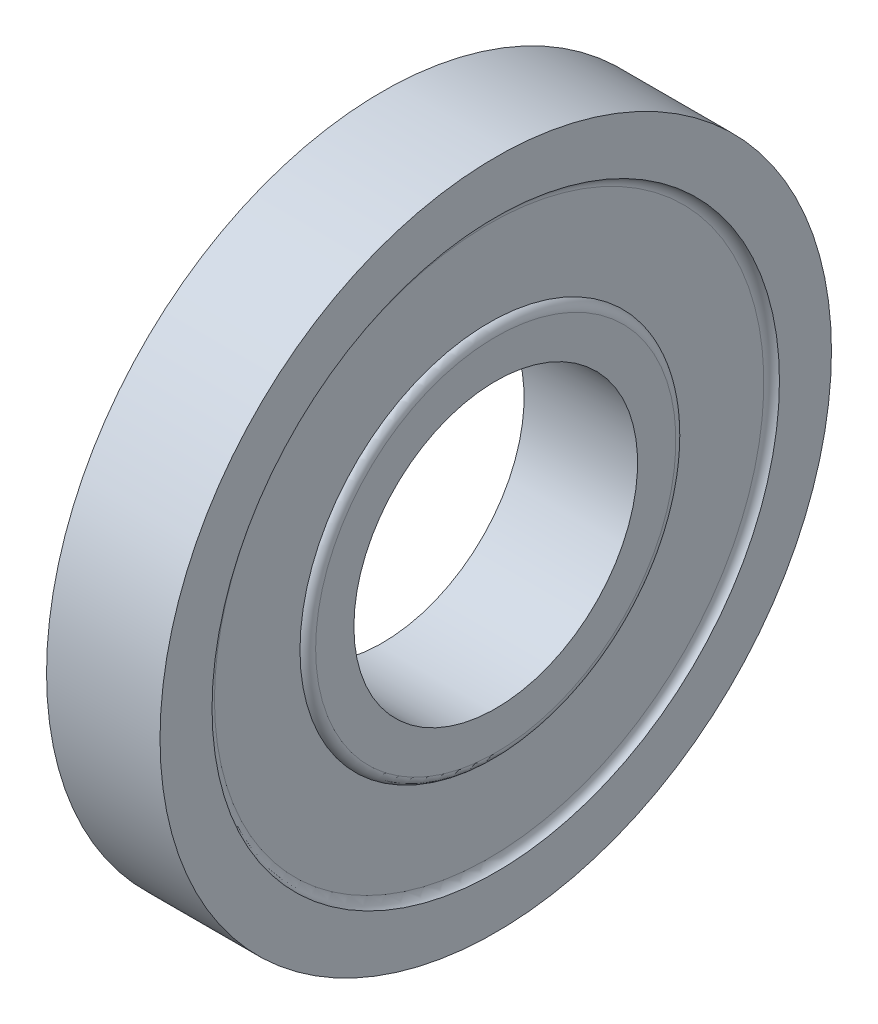
ISO-10303-21;
HEADER;
FILE_DESCRIPTION(('STEP AP214'),'2;1');
FILE_NAME('part.step','',(''),(''),'','','');
FILE_SCHEMA(('AUTOMOTIVE_DESIGN { 1 0 10303 214 1 1 1 1 }'));
ENDSEC;
DATA;
#1=APPLICATION_CONTEXT('core data for automotive mechanical design processes');
#2=APPLICATION_PROTOCOL_DEFINITION('international standard','automotive_design',2000,#1);
#3=PRODUCT_CONTEXT('',#1,'mechanical');
#4=PRODUCT('Part','Part','',(#3));
#5=PRODUCT_RELATED_PRODUCT_CATEGORY('part','',(#4));
#6=PRODUCT_DEFINITION_FORMATION('','',#4);
#7=PRODUCT_DEFINITION_CONTEXT('part definition',#1,'design');
#8=PRODUCT_DEFINITION('design','',#6,#7);
#9=PRODUCT_DEFINITION_SHAPE('','',#8);
#10=(LENGTH_UNIT() NAMED_UNIT(*) SI_UNIT(.MILLI.,.METRE.));
#11=(NAMED_UNIT(*) PLANE_ANGLE_UNIT() SI_UNIT($,.RADIAN.));
#12=(NAMED_UNIT(*) SI_UNIT($,.STERADIAN.) SOLID_ANGLE_UNIT());
#13=UNCERTAINTY_MEASURE_WITH_UNIT(LENGTH_MEASURE(1.E-05),#10,'distance_accuracy_value','');
#14=(GEOMETRIC_REPRESENTATION_CONTEXT(3) GLOBAL_UNCERTAINTY_ASSIGNED_CONTEXT((#13)) GLOBAL_UNIT_ASSIGNED_CONTEXT((#10,
#11,#12)) REPRESENTATION_CONTEXT('',''));
#15=CARTESIAN_POINT('',(0.,0.,0.));
#16=DIRECTION('',(0.,0.,1.));
#17=DIRECTION('',(1.,0.,0.));
#18=AXIS2_PLACEMENT_3D('',#15,#16,#17);
#19=CARTESIAN_POINT('',(-6.,15.,0.));
#20=DIRECTION('',(1.,0.,0.));
#21=DIRECTION('',(0.,0.,-1.));
#22=AXIS2_PLACEMENT_3D('',#19,#20,#21);
#23=PLANE('',#22);
#24=CARTESIAN_POINT('',(-6.,0.,0.));
#25=DIRECTION('',(1.,0.,0.));
#26=DIRECTION('',(0.,0.,-1.));
#27=AXIS2_PLACEMENT_3D('',#24,#25,#26);
#28=CIRCLE('',#27,19.046060798583);
#29=CARTESIAN_POINT('',(-6.,0.,-19.046060798583));
#30=VERTEX_POINT('',#29);
#31=EDGE_CURVE('E55',#30,#30,#28,.F.);
#32=ORIENTED_EDGE('',*,*,#31,.T.);
#33=EDGE_LOOP('',(#32));
#34=FACE_BOUND('',#33,.T.);
#35=CARTESIAN_POINT('',(-6.,0.,0.));
#36=DIRECTION('',(-1.,0.,0.));
#37=DIRECTION('',(0.,0.,1.));
#38=AXIS2_PLACEMENT_3D('',#35,#36,#37);
#39=CIRCLE('',#38,15.);
#40=CARTESIAN_POINT('',(-6.,0.,15.));
#41=VERTEX_POINT('',#40);
#42=EDGE_CURVE('E95',#41,#41,#39,.T.);
#43=ORIENTED_EDGE('',*,*,#42,.F.);
#44=EDGE_LOOP('',(#43));
#45=FACE_BOUND('',#44,.T.);
#46=ADVANCED_FACE('F41',(#34,#45),#23,.F.);
#47=CARTESIAN_POINT('',(-5.29999999999998,20.,0.));
#48=DIRECTION('',(1.,0.,0.));
#49=DIRECTION('',(0.,0.,-1.));
#50=AXIS2_PLACEMENT_3D('',#47,#48,#49);
#51=PLANE('',#50);
#52=CARTESIAN_POINT('',(-5.29999999999998,0.,0.));
#53=DIRECTION('',(1.,0.,0.));
#54=DIRECTION('',(0.,0.,-1.));
#55=AXIS2_PLACEMENT_3D('',#52,#53,#54);
#56=CIRCLE('',#55,29.0460607985831);
#57=CARTESIAN_POINT('',(-5.29999999999998,0.,-29.0460607985831));
#58=VERTEX_POINT('',#57);
#59=EDGE_CURVE('E61',#58,#58,#56,.F.);
#60=ORIENTED_EDGE('',*,*,#59,.T.);
#61=EDGE_LOOP('',(#60));
#62=FACE_BOUND('',#61,.T.);
#63=CARTESIAN_POINT('',(-5.29999999999998,0.,0.));
#64=DIRECTION('',(-1.,0.,0.));
#65=DIRECTION('',(0.,0.,1.));
#66=AXIS2_PLACEMENT_3D('',#63,#64,#65);
#67=CIRCLE('',#66,20.);
#68=CARTESIAN_POINT('',(-5.29999999999998,0.,20.));
#69=VERTEX_POINT('',#68);
#70=EDGE_CURVE('E67',#69,#69,#67,.T.);
#71=ORIENTED_EDGE('',*,*,#70,.F.);
#72=EDGE_LOOP('',(#71));
#73=FACE_BOUND('',#72,.T.);
#74=ADVANCED_FACE('F104',(#62,#73),#51,.F.);
#75=CARTESIAN_POINT('',(-5.99999999999998,30.,0.));
#76=DIRECTION('',(1.,0.,0.));
#77=DIRECTION('',(0.,0.,-1.));
#78=AXIS2_PLACEMENT_3D('',#75,#76,#77);
#79=PLANE('',#78);
#80=CARTESIAN_POINT('',(-5.99999999999998,0.,0.));
#81=DIRECTION('',(-1.,0.,0.));
#82=DIRECTION('',(0.,0.,1.));
#83=AXIS2_PLACEMENT_3D('',#80,#81,#82);
#84=CIRCLE('',#83,30.);
#85=CARTESIAN_POINT('',(-5.99999999999998,0.,30.));
#86=VERTEX_POINT('',#85);
#87=EDGE_CURVE('E71',#86,#86,#84,.T.);
#88=ORIENTED_EDGE('',*,*,#87,.F.);
#89=EDGE_LOOP('',(#88));
#90=FACE_BOUND('',#89,.T.);
#91=CARTESIAN_POINT('',(-5.99999999999998,0.,0.));
#92=DIRECTION('',(-1.,0.,0.));
#93=DIRECTION('',(0.,0.,1.));
#94=AXIS2_PLACEMENT_3D('',#91,#92,#93);
#95=CIRCLE('',#94,35.5);
#96=CARTESIAN_POINT('',(-5.99999999999998,0.,35.5));
#97=VERTEX_POINT('',#96);
#98=EDGE_CURVE('E75',#97,#97,#95,.T.);
#99=ORIENTED_EDGE('',*,*,#98,.T.);
#100=EDGE_LOOP('',(#99));
#101=FACE_BOUND('',#100,.T.);
#102=ADVANCED_FACE('F111',(#90,#101),#79,.F.);
#103=CARTESIAN_POINT('',(-14.540612260204,0.,0.));
#104=DIRECTION('',(-1.,0.,0.));
#105=DIRECTION('',(0.,0.,1.));
#106=AXIS2_PLACEMENT_3D('',#103,#104,#105);
#107=CYLINDRICAL_SURFACE('',#106,35.5);
#108=ORIENTED_EDGE('',*,*,#98,.F.);
#109=EDGE_LOOP('',(#108));
#110=FACE_BOUND('',#109,.T.);
#111=CARTESIAN_POINT('',(6.00000000000002,0.,0.));
#112=DIRECTION('',(-1.,0.,0.));
#113=DIRECTION('',(0.,0.,1.));
#114=AXIS2_PLACEMENT_3D('',#111,#112,#113);
#115=CIRCLE('',#114,35.5);
#116=CARTESIAN_POINT('',(6.00000000000002,0.,35.5));
#117=VERTEX_POINT('',#116);
#118=EDGE_CURVE('E79',#117,#117,#115,.T.);
#119=ORIENTED_EDGE('',*,*,#118,.T.);
#120=EDGE_LOOP('',(#119));
#121=FACE_BOUND('',#120,.T.);
#122=ADVANCED_FACE('F143',(#110,#121),#107,.T.);
#123=CARTESIAN_POINT('',(6.00000000000002,30.,0.));
#124=DIRECTION('',(-1.,0.,0.));
#125=DIRECTION('',(0.,0.,1.));
#126=AXIS2_PLACEMENT_3D('',#123,#124,#125);
#127=PLANE('',#126);
#128=ORIENTED_EDGE('',*,*,#118,.F.);
#129=EDGE_LOOP('',(#128));
#130=FACE_BOUND('',#129,.T.);
#131=CARTESIAN_POINT('',(6.00000000000002,0.,0.));
#132=DIRECTION('',(-1.,0.,0.));
#133=DIRECTION('',(0.,0.,1.));
#134=AXIS2_PLACEMENT_3D('',#131,#132,#133);
#135=CIRCLE('',#134,30.);
#136=CARTESIAN_POINT('',(6.00000000000002,0.,30.));
#137=VERTEX_POINT('',#136);
#138=EDGE_CURVE('E83',#137,#137,#135,.T.);
#139=ORIENTED_EDGE('',*,*,#138,.T.);
#140=EDGE_LOOP('',(#139));
#141=FACE_BOUND('',#140,.T.);
#142=ADVANCED_FACE('F136',(#130,#141),#127,.F.);
#143=CARTESIAN_POINT('',(5.30000000000002,20.,0.));
#144=DIRECTION('',(-1.,0.,0.));
#145=DIRECTION('',(0.,0.,1.));
#146=AXIS2_PLACEMENT_3D('',#143,#144,#145);
#147=PLANE('',#146);
#148=CARTESIAN_POINT('',(5.30000000000002,0.,0.));
#149=DIRECTION('',(-1.,0.,0.));
#150=DIRECTION('',(0.,0.,1.));
#151=AXIS2_PLACEMENT_3D('',#148,#149,#150);
#152=CIRCLE('',#151,29.0460607985831);
#153=CARTESIAN_POINT('',(5.30000000000002,0.,29.0460607985831));
#154=VERTEX_POINT('',#153);
#155=EDGE_CURVE('E10',#154,#154,#152,.F.);
#156=ORIENTED_EDGE('',*,*,#155,.T.);
#157=EDGE_LOOP('',(#156));
#158=FACE_BOUND('',#157,.T.);
#159=CARTESIAN_POINT('',(5.30000000000002,0.,0.));
#160=DIRECTION('',(-1.,0.,0.));
#161=DIRECTION('',(0.,0.,1.));
#162=AXIS2_PLACEMENT_3D('',#159,#160,#161);
#163=CIRCLE('',#162,20.);
#164=CARTESIAN_POINT('',(5.30000000000002,0.,20.));
#165=VERTEX_POINT('',#164);
#166=EDGE_CURVE('E87',#165,#165,#163,.T.);
#167=ORIENTED_EDGE('',*,*,#166,.T.);
#168=EDGE_LOOP('',(#167));
#169=FACE_BOUND('',#168,.T.);
#170=ADVANCED_FACE('F133',(#158,#169),#147,.F.);
#171=CARTESIAN_POINT('',(6.,15.,0.));
#172=DIRECTION('',(-1.,0.,0.));
#173=DIRECTION('',(0.,0.,1.));
#174=AXIS2_PLACEMENT_3D('',#171,#172,#173);
#175=PLANE('',#174);
#176=CARTESIAN_POINT('',(6.,0.,0.));
#177=DIRECTION('',(-1.,0.,0.));
#178=DIRECTION('',(0.,0.,1.));
#179=AXIS2_PLACEMENT_3D('',#176,#177,#178);
#180=CIRCLE('',#179,19.0460607985831);
#181=CARTESIAN_POINT('',(6.,0.,19.0460607985831));
#182=VERTEX_POINT('',#181);
#183=EDGE_CURVE('E49',#182,#182,#180,.F.);
#184=ORIENTED_EDGE('',*,*,#183,.T.);
#185=EDGE_LOOP('',(#184));
#186=FACE_BOUND('',#185,.T.);
#187=CARTESIAN_POINT('',(6.,0.,0.));
#188=DIRECTION('',(-1.,0.,0.));
#189=DIRECTION('',(0.,0.,1.));
#190=AXIS2_PLACEMENT_3D('',#187,#188,#189);
#191=CIRCLE('',#190,15.);
#192=CARTESIAN_POINT('',(6.,0.,15.));
#193=VERTEX_POINT('',#192);
#194=EDGE_CURVE('E91',#193,#193,#191,.T.);
#195=ORIENTED_EDGE('',*,*,#194,.T.);
#196=EDGE_LOOP('',(#195));
#197=FACE_BOUND('',#196,.T.);
#198=ADVANCED_FACE('F135',(#186,#197),#175,.F.);
#199=CARTESIAN_POINT('',(-14.540612260204,0.,0.));
#200=DIRECTION('',(-1.,0.,0.));
#201=DIRECTION('',(0.,0.,1.));
#202=AXIS2_PLACEMENT_3D('',#199,#200,#201);
#203=CYLINDRICAL_SURFACE('',#202,15.);
#204=ORIENTED_EDGE('',*,*,#194,.F.);
#205=EDGE_LOOP('',(#204));
#206=FACE_BOUND('',#205,.T.);
#207=ORIENTED_EDGE('',*,*,#42,.T.);
#208=EDGE_LOOP('',(#207));
#209=FACE_BOUND('',#208,.T.);
#210=ADVANCED_FACE('F101',(#206,#209),#203,.F.);
#211=CARTESIAN_POINT('',(-6.29999999999998,0.,0.));
#212=DIRECTION('',(-1.,0.,0.));
#213=DIRECTION('',(0.,0.,1.));
#214=AXIS2_PLACEMENT_3D('',#211,#212,#213);
#215=TOROIDAL_SURFACE('',#214,29.0460607985831,1.);
#216=ORIENTED_EDGE('',*,*,#87,.T.);
#217=EDGE_LOOP('',(#216));
#218=FACE_BOUND('',#217,.T.);
#219=ORIENTED_EDGE('',*,*,#59,.F.);
#220=EDGE_LOOP('',(#219));
#221=FACE_BOUND('',#220,.T.);
#222=ADVANCED_FACE('F116',(#218,#221),#215,.F.);
#223=CARTESIAN_POINT('',(-5.,0.,0.));
#224=DIRECTION('',(-1.,0.,0.));
#225=DIRECTION('',(0.,0.,1.));
#226=AXIS2_PLACEMENT_3D('',#223,#224,#225);
#227=TOROIDAL_SURFACE('',#226,19.046060798583,1.);
#228=ORIENTED_EDGE('',*,*,#70,.T.);
#229=EDGE_LOOP('',(#228));
#230=FACE_BOUND('',#229,.T.);
#231=ORIENTED_EDGE('',*,*,#31,.F.);
#232=EDGE_LOOP('',(#231));
#233=FACE_BOUND('',#232,.T.);
#234=ADVANCED_FACE('F119',(#230,#233),#227,.T.);
#235=CARTESIAN_POINT('',(5.,0.,0.));
#236=DIRECTION('',(1.,0.,0.));
#237=DIRECTION('',(0.,0.,-1.));
#238=AXIS2_PLACEMENT_3D('',#235,#236,#237);
#239=TOROIDAL_SURFACE('',#238,19.0460607985831,1.);
#240=ORIENTED_EDGE('',*,*,#183,.F.);
#241=EDGE_LOOP('',(#240));
#242=FACE_BOUND('',#241,.T.);
#243=ORIENTED_EDGE('',*,*,#166,.F.);
#244=EDGE_LOOP('',(#243));
#245=FACE_BOUND('',#244,.T.);
#246=ADVANCED_FACE('F122',(#242,#245),#239,.T.);
#247=CARTESIAN_POINT('',(6.30000000000002,0.,0.));
#248=DIRECTION('',(1.,0.,0.));
#249=DIRECTION('',(0.,0.,-1.));
#250=AXIS2_PLACEMENT_3D('',#247,#248,#249);
#251=TOROIDAL_SURFACE('',#250,29.0460607985831,1.);
#252=ORIENTED_EDGE('',*,*,#155,.F.);
#253=EDGE_LOOP('',(#252));
#254=FACE_BOUND('',#253,.T.);
#255=ORIENTED_EDGE('',*,*,#138,.F.);
#256=EDGE_LOOP('',(#255));
#257=FACE_BOUND('',#256,.T.);
#258=ADVANCED_FACE('F43',(#254,#257),#251,.F.);
#259=CLOSED_SHELL('',(#46,#74,#102,#122,#142,#170,#198,#210,#222,#234,#246,#258));
#260=MANIFOLD_SOLID_BREP('B2',#259);
#261=ADVANCED_BREP_SHAPE_REPRESENTATION('',(#18,#260),#14);
#262=SHAPE_DEFINITION_REPRESENTATION(#9,#261);
ENDSEC;
END-ISO-10303-21;
